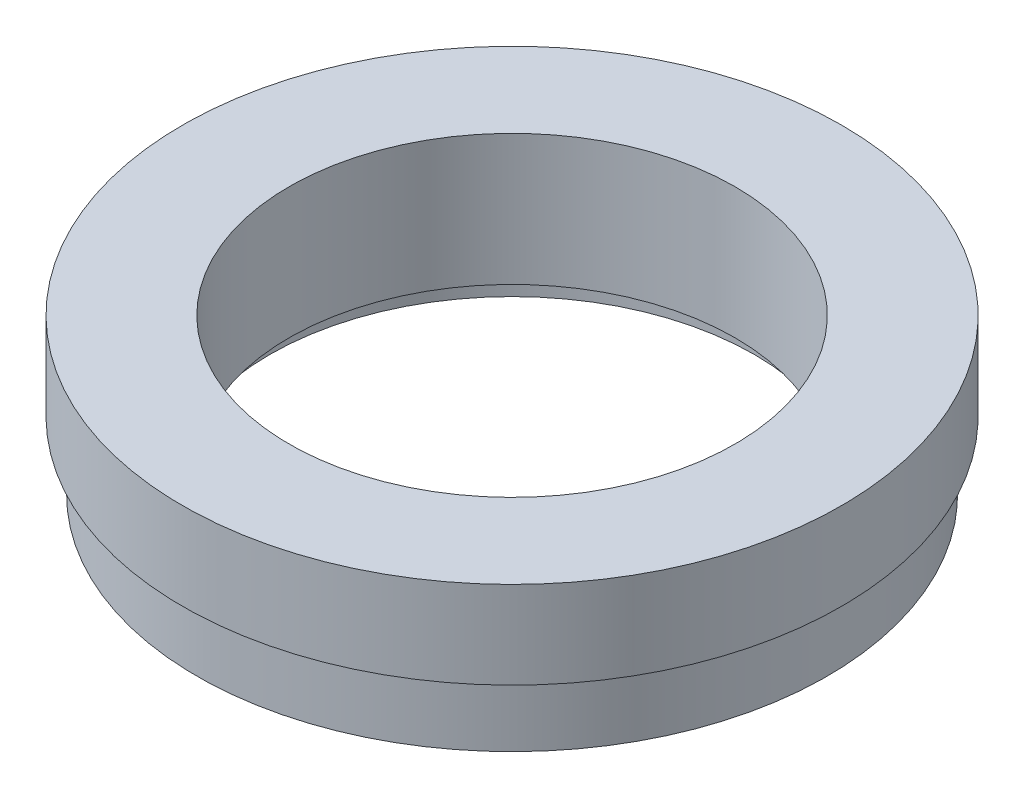
ISO-10303-21;
HEADER;
FILE_DESCRIPTION(('STEP AP214'),'2;1');
FILE_NAME('part.step','',(''),(''),'','','');
FILE_SCHEMA(('AUTOMOTIVE_DESIGN { 1 0 10303 214 1 1 1 1 }'));
ENDSEC;
DATA;
#1=APPLICATION_CONTEXT('core data for automotive mechanical design processes');
#2=APPLICATION_PROTOCOL_DEFINITION('international standard','automotive_design',2000,#1);
#3=PRODUCT_CONTEXT('',#1,'mechanical');
#4=PRODUCT('Part','Part','',(#3));
#5=PRODUCT_RELATED_PRODUCT_CATEGORY('part','',(#4));
#6=PRODUCT_DEFINITION_FORMATION('','',#4);
#7=PRODUCT_DEFINITION_CONTEXT('part definition',#1,'design');
#8=PRODUCT_DEFINITION('design','',#6,#7);
#9=PRODUCT_DEFINITION_SHAPE('','',#8);
#10=(LENGTH_UNIT() NAMED_UNIT(*) SI_UNIT(.MILLI.,.METRE.));
#11=(NAMED_UNIT(*) PLANE_ANGLE_UNIT() SI_UNIT($,.RADIAN.));
#12=(NAMED_UNIT(*) SI_UNIT($,.STERADIAN.) SOLID_ANGLE_UNIT());
#13=UNCERTAINTY_MEASURE_WITH_UNIT(LENGTH_MEASURE(1.E-05),#10,'distance_accuracy_value','');
#14=(GEOMETRIC_REPRESENTATION_CONTEXT(3) GLOBAL_UNCERTAINTY_ASSIGNED_CONTEXT((#13)) GLOBAL_UNIT_ASSIGNED_CONTEXT((#10,
#11,#12)) REPRESENTATION_CONTEXT('',''));
#15=CARTESIAN_POINT('',(0.,0.,0.));
#16=DIRECTION('',(0.,0.,1.));
#17=DIRECTION('',(1.,0.,0.));
#18=AXIS2_PLACEMENT_3D('',#15,#16,#17);
#19=CARTESIAN_POINT('',(25.,2.5,0.));
#20=DIRECTION('',(0.,-1.,0.));
#21=DIRECTION('',(0.,0.,-1.));
#22=AXIS2_PLACEMENT_3D('',#19,#20,#21);
#23=PLANE('',#22);
#24=CARTESIAN_POINT('',(0.,2.5,0.));
#25=DIRECTION('',(0.,-1.,0.));
#26=DIRECTION('',(0.,0.,-1.));
#27=AXIS2_PLACEMENT_3D('',#24,#25,#26);
#28=CIRCLE('',#27,25.);
#29=CARTESIAN_POINT('',(0.,2.5,-25.));
#30=VERTEX_POINT('',#29);
#31=EDGE_CURVE('E58',#30,#30,#28,.T.);
#32=ORIENTED_EDGE('',*,*,#31,.T.);
#33=EDGE_LOOP('',(#32));
#34=FACE_BOUND('',#33,.T.);
#35=CARTESIAN_POINT('',(0.,2.5,0.));
#36=DIRECTION('',(0.,-1.,0.));
#37=DIRECTION('',(0.,0.,-1.));
#38=AXIS2_PLACEMENT_3D('',#35,#36,#37);
#39=CIRCLE('',#38,23.);
#40=CARTESIAN_POINT('',(0.,2.5,-23.));
#41=VERTEX_POINT('',#40);
#42=EDGE_CURVE('E10',#41,#41,#39,.T.);
#43=ORIENTED_EDGE('',*,*,#42,.F.);
#44=EDGE_LOOP('',(#43));
#45=FACE_BOUND('',#44,.T.);
#46=ADVANCED_FACE('F30',(#34,#45),#23,.T.);
#47=CARTESIAN_POINT('',(0.,0.,0.));
#48=DIRECTION('',(0.,-1.,0.));
#49=DIRECTION('',(0.,0.,-1.));
#50=AXIS2_PLACEMENT_3D('',#47,#48,#49);
#51=CYLINDRICAL_SURFACE('',#50,23.);
#52=ORIENTED_EDGE('',*,*,#42,.T.);
#53=EDGE_LOOP('',(#52));
#54=FACE_BOUND('',#53,.T.);
#55=CARTESIAN_POINT('',(0.,16.,0.));
#56=DIRECTION('',(0.,-1.,0.));
#57=DIRECTION('',(0.,0.,-1.));
#58=AXIS2_PLACEMENT_3D('',#55,#56,#57);
#59=CIRCLE('',#58,23.);
#60=CARTESIAN_POINT('',(0.,16.,-23.));
#61=VERTEX_POINT('',#60);
#62=EDGE_CURVE('E36',#61,#61,#59,.T.);
#63=ORIENTED_EDGE('',*,*,#62,.F.);
#64=EDGE_LOOP('',(#63));
#65=FACE_BOUND('',#64,.T.);
#66=ADVANCED_FACE('F76',(#54,#65),#51,.F.);
#67=CARTESIAN_POINT('',(23.,16.,0.));
#68=DIRECTION('',(0.,1.,0.));
#69=DIRECTION('',(0.,0.,1.));
#70=AXIS2_PLACEMENT_3D('',#67,#68,#69);
#71=PLANE('',#70);
#72=ORIENTED_EDGE('',*,*,#62,.T.);
#73=EDGE_LOOP('',(#72));
#74=FACE_BOUND('',#73,.T.);
#75=CARTESIAN_POINT('',(0.,16.,0.));
#76=DIRECTION('',(0.,-1.,0.));
#77=DIRECTION('',(0.,0.,-1.));
#78=AXIS2_PLACEMENT_3D('',#75,#76,#77);
#79=CIRCLE('',#78,34.);
#80=CARTESIAN_POINT('',(0.,16.,-34.));
#81=VERTEX_POINT('',#80);
#82=EDGE_CURVE('E40',#81,#81,#79,.T.);
#83=ORIENTED_EDGE('',*,*,#82,.F.);
#84=EDGE_LOOP('',(#83));
#85=FACE_BOUND('',#84,.T.);
#86=ADVANCED_FACE('F80',(#74,#85),#71,.T.);
#87=CARTESIAN_POINT('',(0.,0.,0.));
#88=DIRECTION('',(0.,-1.,0.));
#89=DIRECTION('',(0.,0.,-1.));
#90=AXIS2_PLACEMENT_3D('',#87,#88,#89);
#91=CYLINDRICAL_SURFACE('',#90,34.);
#92=ORIENTED_EDGE('',*,*,#82,.T.);
#93=EDGE_LOOP('',(#92));
#94=FACE_BOUND('',#93,.T.);
#95=CARTESIAN_POINT('',(0.,7.,0.));
#96=DIRECTION('',(0.,-1.,0.));
#97=DIRECTION('',(0.,0.,-1.));
#98=AXIS2_PLACEMENT_3D('',#95,#96,#97);
#99=CIRCLE('',#98,34.);
#100=CARTESIAN_POINT('',(0.,7.,-34.));
#101=VERTEX_POINT('',#100);
#102=EDGE_CURVE('E44',#101,#101,#99,.T.);
#103=ORIENTED_EDGE('',*,*,#102,.F.);
#104=EDGE_LOOP('',(#103));
#105=FACE_BOUND('',#104,.T.);
#106=ADVANCED_FACE('F84',(#94,#105),#91,.T.);
#107=CARTESIAN_POINT('',(34.,7.,0.));
#108=DIRECTION('',(0.,-1.,0.));
#109=DIRECTION('',(0.,0.,-1.));
#110=AXIS2_PLACEMENT_3D('',#107,#108,#109);
#111=PLANE('',#110);
#112=ORIENTED_EDGE('',*,*,#102,.T.);
#113=EDGE_LOOP('',(#112));
#114=FACE_BOUND('',#113,.T.);
#115=CARTESIAN_POINT('',(0.,7.,0.));
#116=DIRECTION('',(0.,-1.,0.));
#117=DIRECTION('',(0.,0.,-1.));
#118=AXIS2_PLACEMENT_3D('',#115,#116,#117);
#119=CIRCLE('',#118,32.5);
#120=CARTESIAN_POINT('',(0.,7.,-32.5));
#121=VERTEX_POINT('',#120);
#122=EDGE_CURVE('E49',#121,#121,#119,.T.);
#123=ORIENTED_EDGE('',*,*,#122,.F.);
#124=EDGE_LOOP('',(#123));
#125=FACE_BOUND('',#124,.T.);
#126=ADVANCED_FACE('F90',(#114,#125),#111,.T.);
#127=CARTESIAN_POINT('',(0.,0.,0.));
#128=DIRECTION('',(0.,-1.,0.));
#129=DIRECTION('',(0.,0.,-1.));
#130=AXIS2_PLACEMENT_3D('',#127,#128,#129);
#131=CYLINDRICAL_SURFACE('',#130,32.5);
#132=ORIENTED_EDGE('',*,*,#122,.T.);
#133=EDGE_LOOP('',(#132));
#134=FACE_BOUND('',#133,.T.);
#135=CARTESIAN_POINT('',(0.,0.,0.));
#136=DIRECTION('',(0.,-1.,0.));
#137=DIRECTION('',(0.,0.,-1.));
#138=AXIS2_PLACEMENT_3D('',#135,#136,#137);
#139=CIRCLE('',#138,32.5);
#140=CARTESIAN_POINT('',(0.,0.,-32.5));
#141=VERTEX_POINT('',#140);
#142=EDGE_CURVE('E52',#141,#141,#139,.T.);
#143=ORIENTED_EDGE('',*,*,#142,.F.);
#144=EDGE_LOOP('',(#143));
#145=FACE_BOUND('',#144,.T.);
#146=ADVANCED_FACE('F72',(#134,#145),#131,.T.);
#147=CARTESIAN_POINT('',(32.5,0.,0.));
#148=DIRECTION('',(0.,-1.,0.));
#149=DIRECTION('',(0.,0.,-1.));
#150=AXIS2_PLACEMENT_3D('',#147,#148,#149);
#151=PLANE('',#150);
#152=ORIENTED_EDGE('',*,*,#142,.T.);
#153=EDGE_LOOP('',(#152));
#154=FACE_BOUND('',#153,.T.);
#155=CARTESIAN_POINT('',(0.,0.,0.));
#156=DIRECTION('',(0.,-1.,0.));
#157=DIRECTION('',(0.,0.,-1.));
#158=AXIS2_PLACEMENT_3D('',#155,#156,#157);
#159=CIRCLE('',#158,25.);
#160=CARTESIAN_POINT('',(0.,0.,-25.));
#161=VERTEX_POINT('',#160);
#162=EDGE_CURVE('E55',#161,#161,#159,.T.);
#163=ORIENTED_EDGE('',*,*,#162,.F.);
#164=EDGE_LOOP('',(#163));
#165=FACE_BOUND('',#164,.T.);
#166=ADVANCED_FACE('F66',(#154,#165),#151,.T.);
#167=CARTESIAN_POINT('',(0.,0.,0.));
#168=DIRECTION('',(0.,-1.,0.));
#169=DIRECTION('',(0.,0.,-1.));
#170=AXIS2_PLACEMENT_3D('',#167,#168,#169);
#171=CYLINDRICAL_SURFACE('',#170,25.);
#172=ORIENTED_EDGE('',*,*,#162,.T.);
#173=EDGE_LOOP('',(#172));
#174=FACE_BOUND('',#173,.T.);
#175=ORIENTED_EDGE('',*,*,#31,.F.);
#176=EDGE_LOOP('',(#175));
#177=FACE_BOUND('',#176,.T.);
#178=ADVANCED_FACE('F64',(#174,#177),#171,.F.);
#179=CLOSED_SHELL('',(#46,#66,#86,#106,#126,#146,#166,#178));
#180=MANIFOLD_SOLID_BREP('B2',#179);
#181=ADVANCED_BREP_SHAPE_REPRESENTATION('',(#18,#180),#14);
#182=SHAPE_DEFINITION_REPRESENTATION(#9,#181);
ENDSEC;
END-ISO-10303-21;
